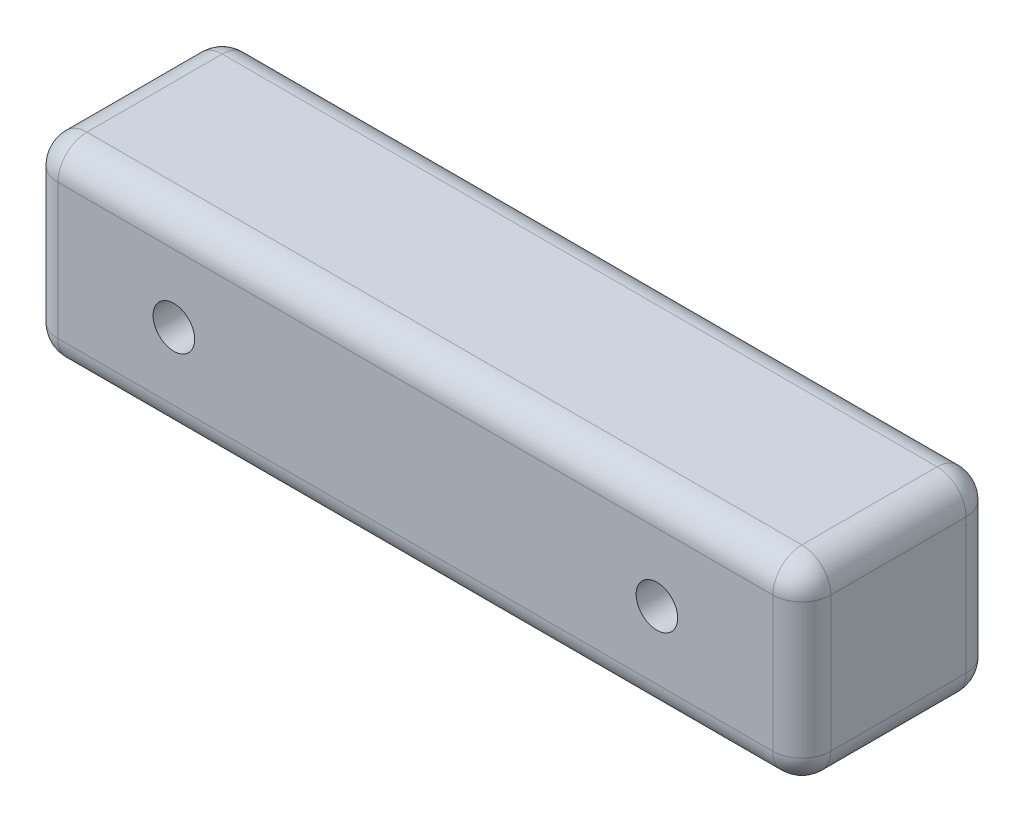
ISO-10303-21;
HEADER;
FILE_DESCRIPTION(('STEP AP214'),'2;1');
FILE_NAME('part.step','',(''),(''),'','','');
FILE_SCHEMA(('AUTOMOTIVE_DESIGN { 1 0 10303 214 1 1 1 1 }'));
ENDSEC;
DATA;
#1=APPLICATION_CONTEXT('core data for automotive mechanical design processes');
#2=APPLICATION_PROTOCOL_DEFINITION('international standard','automotive_design',2000,#1);
#3=PRODUCT_CONTEXT('',#1,'mechanical');
#4=PRODUCT('Part','Part','',(#3));
#5=PRODUCT_RELATED_PRODUCT_CATEGORY('part','',(#4));
#6=PRODUCT_DEFINITION_FORMATION('','',#4);
#7=PRODUCT_DEFINITION_CONTEXT('part definition',#1,'design');
#8=PRODUCT_DEFINITION('design','',#6,#7);
#9=PRODUCT_DEFINITION_SHAPE('','',#8);
#10=(LENGTH_UNIT() NAMED_UNIT(*) SI_UNIT(.MILLI.,.METRE.));
#11=(NAMED_UNIT(*) PLANE_ANGLE_UNIT() SI_UNIT($,.RADIAN.));
#12=(NAMED_UNIT(*) SI_UNIT($,.STERADIAN.) SOLID_ANGLE_UNIT());
#13=UNCERTAINTY_MEASURE_WITH_UNIT(LENGTH_MEASURE(1.E-05),#10,'distance_accuracy_value','');
#14=(GEOMETRIC_REPRESENTATION_CONTEXT(3) GLOBAL_UNCERTAINTY_ASSIGNED_CONTEXT((#13)) GLOBAL_UNIT_ASSIGNED_CONTEXT((#10,
#11,#12)) REPRESENTATION_CONTEXT('',''));
#15=CARTESIAN_POINT('',(0.,0.,0.));
#16=DIRECTION('',(0.,0.,1.));
#17=DIRECTION('',(1.,0.,0.));
#18=AXIS2_PLACEMENT_3D('',#15,#16,#17);
#19=CARTESIAN_POINT('',(0.,0.,20.));
#20=DIRECTION('',(0.,0.,-1.));
#21=DIRECTION('',(-1.,0.,0.));
#22=AXIS2_PLACEMENT_3D('',#19,#20,#21);
#23=PLANE('',#22);
#24=DIRECTION('',(0.,-1.,0.));
#25=VECTOR('',#24,1.);
#26=CARTESIAN_POINT('',(-37.,0.,20.));
#27=LINE('',#26,#25);
#28=CARTESIAN_POINT('',(-37.,6.99999999999999,20.));
#29=VERTEX_POINT('',#28);
#30=CARTESIAN_POINT('',(-37.,-7.00000000000001,20.));
#31=VERTEX_POINT('',#30);
#32=EDGE_CURVE('E166',#29,#31,#27,.T.);
#33=ORIENTED_EDGE('',*,*,#32,.T.);
#34=DIRECTION('',(1.,0.,0.));
#35=VECTOR('',#34,1.);
#36=CARTESIAN_POINT('',(0.,-7.,20.));
#37=LINE('',#36,#35);
#38=CARTESIAN_POINT('',(37.,-6.99999999999999,20.));
#39=VERTEX_POINT('',#38);
#40=EDGE_CURVE('E137',#31,#39,#37,.T.);
#41=ORIENTED_EDGE('',*,*,#40,.T.);
#42=DIRECTION('',(0.,1.,0.));
#43=VECTOR('',#42,1.);
#44=CARTESIAN_POINT('',(37.,0.,20.));
#45=LINE('',#44,#43);
#46=CARTESIAN_POINT('',(37.,7.00000000000001,20.));
#47=VERTEX_POINT('',#46);
#48=EDGE_CURVE('E155',#39,#47,#45,.T.);
#49=ORIENTED_EDGE('',*,*,#48,.T.);
#50=DIRECTION('',(-1.,0.,0.));
#51=VECTOR('',#50,1.);
#52=CARTESIAN_POINT('',(0.,7.,20.));
#53=LINE('',#52,#51);
#54=EDGE_CURVE('E161',#47,#29,#53,.T.);
#55=ORIENTED_EDGE('',*,*,#54,.T.);
#56=EDGE_LOOP('',(#33,#41,#49,#55));
#57=FACE_BOUND('',#56,.T.);
#58=CARTESIAN_POINT('',(25.,0.,20.));
#59=DIRECTION('',(0.,0.,1.));
#60=DIRECTION('',(1.,0.,0.));
#61=AXIS2_PLACEMENT_3D('',#58,#59,#60);
#62=CIRCLE('',#61,2.15);
#63=CARTESIAN_POINT('',(27.15,0.,20.));
#64=VERTEX_POINT('',#63);
#65=EDGE_CURVE('E162',#64,#64,#62,.T.);
#66=ORIENTED_EDGE('',*,*,#65,.F.);
#67=EDGE_LOOP('',(#66));
#68=FACE_BOUND('',#67,.T.);
#69=CARTESIAN_POINT('',(-25.,0.,20.));
#70=DIRECTION('',(0.,0.,1.));
#71=DIRECTION('',(-1.,0.,0.));
#72=AXIS2_PLACEMENT_3D('',#69,#70,#71);
#73=CIRCLE('',#72,2.15);
#74=CARTESIAN_POINT('',(-27.15,0.,20.));
#75=VERTEX_POINT('',#74);
#76=EDGE_CURVE('E270',#75,#75,#73,.T.);
#77=ORIENTED_EDGE('',*,*,#76,.F.);
#78=EDGE_LOOP('',(#77));
#79=FACE_BOUND('',#78,.T.);
#80=ADVANCED_FACE('F39',(#57,#68,#79),#23,.F.);
#81=CARTESIAN_POINT('',(0.,0.,0.));
#82=DIRECTION('',(0.,0.,-1.));
#83=DIRECTION('',(-1.,0.,0.));
#84=AXIS2_PLACEMENT_3D('',#81,#82,#83);
#85=PLANE('',#84);
#86=DIRECTION('',(0.,1.,0.));
#87=VECTOR('',#86,1.);
#88=CARTESIAN_POINT('',(37.,-9.99999999999999,0.));
#89=LINE('',#88,#87);
#90=CARTESIAN_POINT('',(37.,7.00000000000001,0.));
#91=VERTEX_POINT('',#90);
#92=CARTESIAN_POINT('',(37.,-6.99999999999999,0.));
#93=VERTEX_POINT('',#92);
#94=EDGE_CURVE('E63',#91,#93,#89,.F.);
#95=ORIENTED_EDGE('',*,*,#94,.T.);
#96=DIRECTION('',(1.,0.,0.));
#97=VECTOR('',#96,1.);
#98=CARTESIAN_POINT('',(-40.,-7.00000000000001,0.));
#99=LINE('',#98,#97);
#100=CARTESIAN_POINT('',(-37.,-7.00000000000001,0.));
#101=VERTEX_POINT('',#100);
#102=EDGE_CURVE('E11',#93,#101,#99,.F.);
#103=ORIENTED_EDGE('',*,*,#102,.T.);
#104=DIRECTION('',(0.,-1.,0.));
#105=VECTOR('',#104,1.);
#106=CARTESIAN_POINT('',(-37.,9.99999999999999,0.));
#107=LINE('',#106,#105);
#108=CARTESIAN_POINT('',(-37.,6.99999999999999,0.));
#109=VERTEX_POINT('',#108);
#110=EDGE_CURVE('E48',#101,#109,#107,.F.);
#111=ORIENTED_EDGE('',*,*,#110,.T.);
#112=DIRECTION('',(-1.,0.,0.));
#113=VECTOR('',#112,1.);
#114=CARTESIAN_POINT('',(40.,7.00000000000001,0.));
#115=LINE('',#114,#113);
#116=EDGE_CURVE('E206',#109,#91,#115,.F.);
#117=ORIENTED_EDGE('',*,*,#116,.T.);
#118=EDGE_LOOP('',(#95,#103,#111,#117));
#119=FACE_BOUND('',#118,.T.);
#120=CARTESIAN_POINT('',(25.,0.,0.));
#121=DIRECTION('',(0.,0.,1.));
#122=DIRECTION('',(1.,0.,0.));
#123=AXIS2_PLACEMENT_3D('',#120,#121,#122);
#124=CIRCLE('',#123,2.15);
#125=CARTESIAN_POINT('',(27.15,0.,0.));
#126=VERTEX_POINT('',#125);
#127=EDGE_CURVE('E275',#126,#126,#124,.T.);
#128=ORIENTED_EDGE('',*,*,#127,.T.);
#129=EDGE_LOOP('',(#128));
#130=FACE_BOUND('',#129,.T.);
#131=CARTESIAN_POINT('',(-25.,0.,0.));
#132=DIRECTION('',(0.,0.,1.));
#133=DIRECTION('',(-1.,0.,0.));
#134=AXIS2_PLACEMENT_3D('',#131,#132,#133);
#135=CIRCLE('',#134,2.15);
#136=CARTESIAN_POINT('',(-27.15,0.,0.));
#137=VERTEX_POINT('',#136);
#138=EDGE_CURVE('E264',#137,#137,#135,.T.);
#139=ORIENTED_EDGE('',*,*,#138,.T.);
#140=EDGE_LOOP('',(#139));
#141=FACE_BOUND('',#140,.T.);
#142=ADVANCED_FACE('F331',(#119,#130,#141),#85,.T.);
#143=CARTESIAN_POINT('',(-40.,-10.,20.));
#144=DIRECTION('',(1.,0.,0.));
#145=DIRECTION('',(0.,1.,0.));
#146=AXIS2_PLACEMENT_3D('',#143,#144,#145);
#147=PLANE('',#146);
#148=DIRECTION('',(0.,-1.,0.));
#149=VECTOR('',#148,1.);
#150=CARTESIAN_POINT('',(-40.,-10.,3.));
#151=LINE('',#150,#149);
#152=CARTESIAN_POINT('',(-40.,6.99999999999999,3.));
#153=VERTEX_POINT('',#152);
#154=CARTESIAN_POINT('',(-40.,-7.00000000000001,3.));
#155=VERTEX_POINT('',#154);
#156=EDGE_CURVE('E181',#153,#155,#151,.T.);
#157=ORIENTED_EDGE('',*,*,#156,.T.);
#158=DIRECTION('',(0.,0.,-1.));
#159=VECTOR('',#158,1.);
#160=CARTESIAN_POINT('',(-40.,-7.00000000000001,20.));
#161=LINE('',#160,#159);
#162=CARTESIAN_POINT('',(-40.,-7.00000000000001,17.));
#163=VERTEX_POINT('',#162);
#164=EDGE_CURVE('E185',#155,#163,#161,.F.);
#165=ORIENTED_EDGE('',*,*,#164,.T.);
#166=DIRECTION('',(0.,-1.,0.));
#167=VECTOR('',#166,1.);
#168=CARTESIAN_POINT('',(-40.,-10.,17.));
#169=LINE('',#168,#167);
#170=CARTESIAN_POINT('',(-40.,6.99999999999999,17.));
#171=VERTEX_POINT('',#170);
#172=EDGE_CURVE('E183',#163,#171,#169,.F.);
#173=ORIENTED_EDGE('',*,*,#172,.T.);
#174=DIRECTION('',(0.,0.,-1.));
#175=VECTOR('',#174,1.);
#176=CARTESIAN_POINT('',(-40.,6.99999999999999,20.));
#177=LINE('',#176,#175);
#178=EDGE_CURVE('E179',#171,#153,#177,.T.);
#179=ORIENTED_EDGE('',*,*,#178,.T.);
#180=EDGE_LOOP('',(#157,#165,#173,#179));
#181=FACE_BOUND('',#180,.T.);
#182=ADVANCED_FACE('F337',(#181),#147,.F.);
#183=CARTESIAN_POINT('',(40.,-9.99999999999999,20.));
#184=DIRECTION('',(0.,1.,0.));
#185=DIRECTION('',(-1.,0.,0.));
#186=AXIS2_PLACEMENT_3D('',#183,#184,#185);
#187=PLANE('',#186);
#188=DIRECTION('',(0.,0.,-1.));
#189=VECTOR('',#188,1.);
#190=CARTESIAN_POINT('',(37.,-9.99999999999999,20.));
#191=LINE('',#190,#189);
#192=CARTESIAN_POINT('',(37.,-9.99999999999999,3.));
#193=VERTEX_POINT('',#192);
#194=CARTESIAN_POINT('',(37.,-9.99999999999999,17.));
#195=VERTEX_POINT('',#194);
#196=EDGE_CURVE('E170',#193,#195,#191,.F.);
#197=ORIENTED_EDGE('',*,*,#196,.T.);
#198=DIRECTION('',(1.,0.,0.));
#199=VECTOR('',#198,1.);
#200=CARTESIAN_POINT('',(40.,-9.99999999999999,17.));
#201=LINE('',#200,#199);
#202=CARTESIAN_POINT('',(-37.,-10.,17.));
#203=VERTEX_POINT('',#202);
#204=EDGE_CURVE('E139',#195,#203,#201,.F.);
#205=ORIENTED_EDGE('',*,*,#204,.T.);
#206=DIRECTION('',(0.,0.,-1.));
#207=VECTOR('',#206,1.);
#208=CARTESIAN_POINT('',(-37.,-10.,20.));
#209=LINE('',#208,#207);
#210=CARTESIAN_POINT('',(-37.,-10.,3.));
#211=VERTEX_POINT('',#210);
#212=EDGE_CURVE('E176',#203,#211,#209,.T.);
#213=ORIENTED_EDGE('',*,*,#212,.T.);
#214=DIRECTION('',(1.,0.,0.));
#215=VECTOR('',#214,1.);
#216=CARTESIAN_POINT('',(40.,-9.99999999999999,3.));
#217=LINE('',#216,#215);
#218=EDGE_CURVE('E168',#211,#193,#217,.T.);
#219=ORIENTED_EDGE('',*,*,#218,.T.);
#220=EDGE_LOOP('',(#197,#205,#213,#219));
#221=FACE_BOUND('',#220,.T.);
#222=ADVANCED_FACE('F303',(#221),#187,.F.);
#223=CARTESIAN_POINT('',(40.,10.,20.));
#224=DIRECTION('',(-1.,0.,0.));
#225=DIRECTION('',(0.,-1.,0.));
#226=AXIS2_PLACEMENT_3D('',#223,#224,#225);
#227=PLANE('',#226);
#228=DIRECTION('',(0.,0.,-1.));
#229=VECTOR('',#228,1.);
#230=CARTESIAN_POINT('',(40.,7.00000000000001,20.));
#231=LINE('',#230,#229);
#232=CARTESIAN_POINT('',(40.,7.00000000000001,3.));
#233=VERTEX_POINT('',#232);
#234=CARTESIAN_POINT('',(40.,7.00000000000001,17.));
#235=VERTEX_POINT('',#234);
#236=EDGE_CURVE('E199',#233,#235,#231,.F.);
#237=ORIENTED_EDGE('',*,*,#236,.T.);
#238=DIRECTION('',(0.,1.,0.));
#239=VECTOR('',#238,1.);
#240=CARTESIAN_POINT('',(40.,10.,17.));
#241=LINE('',#240,#239);
#242=CARTESIAN_POINT('',(40.,-6.99999999999999,17.));
#243=VERTEX_POINT('',#242);
#244=EDGE_CURVE('E203',#235,#243,#241,.F.);
#245=ORIENTED_EDGE('',*,*,#244,.T.);
#246=DIRECTION('',(0.,0.,-1.));
#247=VECTOR('',#246,1.);
#248=CARTESIAN_POINT('',(40.,-6.99999999999999,20.));
#249=LINE('',#248,#247);
#250=CARTESIAN_POINT('',(40.,-6.99999999999999,3.));
#251=VERTEX_POINT('',#250);
#252=EDGE_CURVE('E201',#243,#251,#249,.T.);
#253=ORIENTED_EDGE('',*,*,#252,.T.);
#254=DIRECTION('',(0.,1.,0.));
#255=VECTOR('',#254,1.);
#256=CARTESIAN_POINT('',(40.,10.,3.));
#257=LINE('',#256,#255);
#258=EDGE_CURVE('E197',#251,#233,#257,.T.);
#259=ORIENTED_EDGE('',*,*,#258,.T.);
#260=EDGE_LOOP('',(#237,#245,#253,#259));
#261=FACE_BOUND('',#260,.T.);
#262=ADVANCED_FACE('F311',(#261),#227,.F.);
#263=CARTESIAN_POINT('',(-40.,9.99999999999999,20.));
#264=DIRECTION('',(0.,-1.,0.));
#265=DIRECTION('',(1.,0.,0.));
#266=AXIS2_PLACEMENT_3D('',#263,#264,#265);
#267=PLANE('',#266);
#268=DIRECTION('',(0.,0.,-1.));
#269=VECTOR('',#268,1.);
#270=CARTESIAN_POINT('',(-37.,9.99999999999999,20.));
#271=LINE('',#270,#269);
#272=CARTESIAN_POINT('',(-37.,9.99999999999999,3.));
#273=VERTEX_POINT('',#272);
#274=CARTESIAN_POINT('',(-37.,9.99999999999999,17.));
#275=VERTEX_POINT('',#274);
#276=EDGE_CURVE('E192',#273,#275,#271,.F.);
#277=ORIENTED_EDGE('',*,*,#276,.T.);
#278=DIRECTION('',(-1.,0.,0.));
#279=VECTOR('',#278,1.);
#280=CARTESIAN_POINT('',(-40.,9.99999999999999,17.));
#281=LINE('',#280,#279);
#282=CARTESIAN_POINT('',(37.,10.,17.));
#283=VERTEX_POINT('',#282);
#284=EDGE_CURVE('E194',#275,#283,#281,.F.);
#285=ORIENTED_EDGE('',*,*,#284,.T.);
#286=DIRECTION('',(0.,0.,-1.));
#287=VECTOR('',#286,1.);
#288=CARTESIAN_POINT('',(37.,10.,20.));
#289=LINE('',#288,#287);
#290=CARTESIAN_POINT('',(37.,10.,3.));
#291=VERTEX_POINT('',#290);
#292=EDGE_CURVE('E190',#283,#291,#289,.T.);
#293=ORIENTED_EDGE('',*,*,#292,.T.);
#294=DIRECTION('',(-1.,0.,0.));
#295=VECTOR('',#294,1.);
#296=CARTESIAN_POINT('',(-40.,9.99999999999999,3.));
#297=LINE('',#296,#295);
#298=EDGE_CURVE('E188',#291,#273,#297,.T.);
#299=ORIENTED_EDGE('',*,*,#298,.T.);
#300=EDGE_LOOP('',(#277,#285,#293,#299));
#301=FACE_BOUND('',#300,.T.);
#302=ADVANCED_FACE('F343',(#301),#267,.F.);
#303=CARTESIAN_POINT('',(25.,0.,20.));
#304=DIRECTION('',(0.,0.,-1.));
#305=DIRECTION('',(-1.,0.,0.));
#306=AXIS2_PLACEMENT_3D('',#303,#304,#305);
#307=CYLINDRICAL_SURFACE('',#306,2.15);
#308=ORIENTED_EDGE('',*,*,#65,.T.);
#309=EDGE_LOOP('',(#308));
#310=FACE_BOUND('',#309,.T.);
#311=ORIENTED_EDGE('',*,*,#127,.F.);
#312=EDGE_LOOP('',(#311));
#313=FACE_BOUND('',#312,.T.);
#314=ADVANCED_FACE('F340',(#310,#313),#307,.F.);
#315=CARTESIAN_POINT('',(-25.,0.,20.));
#316=DIRECTION('',(0.,0.,-1.));
#317=DIRECTION('',(-1.,0.,0.));
#318=AXIS2_PLACEMENT_3D('',#315,#316,#317);
#319=CYLINDRICAL_SURFACE('',#318,2.15);
#320=ORIENTED_EDGE('',*,*,#76,.T.);
#321=EDGE_LOOP('',(#320));
#322=FACE_BOUND('',#321,.T.);
#323=ORIENTED_EDGE('',*,*,#138,.F.);
#324=EDGE_LOOP('',(#323));
#325=FACE_BOUND('',#324,.T.);
#326=ADVANCED_FACE('F501',(#322,#325),#319,.F.);
#327=CARTESIAN_POINT('',(-40.,6.99999999999999,3.));
#328=DIRECTION('',(1.,0.,0.));
#329=DIRECTION('',(0.,1.,0.));
#330=AXIS2_PLACEMENT_3D('',#327,#328,#329);
#331=CYLINDRICAL_SURFACE('',#330,3.);
#332=CARTESIAN_POINT('',(-37.,6.99999999999999,3.));
#333=DIRECTION('',(-1.,0.,0.));
#334=DIRECTION('',(0.,0.,1.));
#335=AXIS2_PLACEMENT_3D('',#332,#333,#334);
#336=CIRCLE('',#335,3.);
#337=EDGE_CURVE('E43',#273,#109,#336,.T.);
#338=ORIENTED_EDGE('',*,*,#337,.F.);
#339=ORIENTED_EDGE('',*,*,#298,.F.);
#340=CARTESIAN_POINT('',(37.,7.00000000000001,3.));
#341=DIRECTION('',(1.,0.,0.));
#342=DIRECTION('',(0.,0.,-1.));
#343=AXIS2_PLACEMENT_3D('',#340,#341,#342);
#344=CIRCLE('',#343,3.);
#345=EDGE_CURVE('E257',#91,#291,#344,.T.);
#346=ORIENTED_EDGE('',*,*,#345,.F.);
#347=ORIENTED_EDGE('',*,*,#116,.F.);
#348=EDGE_LOOP('',(#338,#339,#346,#347));
#349=FACE_BOUND('',#348,.T.);
#350=ADVANCED_FACE('F41',(#349),#331,.T.);
#351=CARTESIAN_POINT('',(-37.,6.99999999999999,3.));
#352=DIRECTION('',(0.,0.,-1.));
#353=DIRECTION('',(-1.,0.,0.));
#354=AXIS2_PLACEMENT_3D('',#351,#352,#353);
#355=SPHERICAL_SURFACE('',#354,3.);
#356=CARTESIAN_POINT('',(-37.,6.99999999999999,3.));
#357=DIRECTION('',(0.,0.,-1.));
#358=DIRECTION('',(-1.,0.,0.));
#359=AXIS2_PLACEMENT_3D('',#356,#357,#358);
#360=CIRCLE('',#359,3.);
#361=EDGE_CURVE('E252',#273,#153,#360,.F.);
#362=ORIENTED_EDGE('',*,*,#361,.F.);
#363=ORIENTED_EDGE('',*,*,#337,.T.);
#364=CARTESIAN_POINT('',(-37.,6.99999999999999,3.));
#365=DIRECTION('',(0.,1.,0.));
#366=DIRECTION('',(-1.,0.,0.));
#367=AXIS2_PLACEMENT_3D('',#364,#365,#366);
#368=CIRCLE('',#367,3.);
#369=EDGE_CURVE('E255',#153,#109,#368,.F.);
#370=ORIENTED_EDGE('',*,*,#369,.F.);
#371=EDGE_LOOP('',(#362,#363,#370));
#372=FACE_BOUND('',#371,.T.);
#373=ADVANCED_FACE('F487',(#372),#355,.T.);
#374=CARTESIAN_POINT('',(37.,7.00000000000001,3.));
#375=DIRECTION('',(0.,1.,0.));
#376=DIRECTION('',(0.,0.,1.));
#377=AXIS2_PLACEMENT_3D('',#374,#375,#376);
#378=SPHERICAL_SURFACE('',#377,3.);
#379=CARTESIAN_POINT('',(37.,7.00000000000001,3.));
#380=DIRECTION('',(0.,1.,0.));
#381=DIRECTION('',(-1.,0.,0.));
#382=AXIS2_PLACEMENT_3D('',#379,#380,#381);
#383=CIRCLE('',#382,3.);
#384=EDGE_CURVE('E246',#91,#233,#383,.F.);
#385=ORIENTED_EDGE('',*,*,#384,.F.);
#386=ORIENTED_EDGE('',*,*,#345,.T.);
#387=CARTESIAN_POINT('',(37.,7.00000000000001,3.));
#388=DIRECTION('',(0.,0.,-1.));
#389=DIRECTION('',(-1.,0.,0.));
#390=AXIS2_PLACEMENT_3D('',#387,#388,#389);
#391=CIRCLE('',#390,3.);
#392=EDGE_CURVE('E249',#233,#291,#391,.F.);
#393=ORIENTED_EDGE('',*,*,#392,.F.);
#394=EDGE_LOOP('',(#385,#386,#393));
#395=FACE_BOUND('',#394,.T.);
#396=ADVANCED_FACE('F478',(#395),#378,.T.);
#397=CARTESIAN_POINT('',(-37.,-10.,3.));
#398=DIRECTION('',(0.,1.,0.));
#399=DIRECTION('',(-1.,0.,0.));
#400=AXIS2_PLACEMENT_3D('',#397,#398,#399);
#401=CYLINDRICAL_SURFACE('',#400,3.);
#402=ORIENTED_EDGE('',*,*,#369,.T.);
#403=ORIENTED_EDGE('',*,*,#110,.F.);
#404=CARTESIAN_POINT('',(-37.,-7.00000000000001,3.));
#405=DIRECTION('',(0.,-1.,0.));
#406=DIRECTION('',(1.,0.,0.));
#407=AXIS2_PLACEMENT_3D('',#404,#405,#406);
#408=CIRCLE('',#407,3.);
#409=EDGE_CURVE('E56',#155,#101,#408,.T.);
#410=ORIENTED_EDGE('',*,*,#409,.F.);
#411=ORIENTED_EDGE('',*,*,#156,.F.);
#412=EDGE_LOOP('',(#402,#403,#410,#411));
#413=FACE_BOUND('',#412,.T.);
#414=ADVANCED_FACE('F469',(#413),#401,.T.);
#415=CARTESIAN_POINT('',(-37.,6.99999999999999,20.));
#416=DIRECTION('',(0.,0.,-1.));
#417=DIRECTION('',(-1.,0.,0.));
#418=AXIS2_PLACEMENT_3D('',#415,#416,#417);
#419=CYLINDRICAL_SURFACE('',#418,3.);
#420=ORIENTED_EDGE('',*,*,#361,.T.);
#421=ORIENTED_EDGE('',*,*,#178,.F.);
#422=CARTESIAN_POINT('',(-37.,6.99999999999999,17.));
#423=DIRECTION('',(0.,0.,1.));
#424=DIRECTION('',(1.,0.,0.));
#425=AXIS2_PLACEMENT_3D('',#422,#423,#424);
#426=CIRCLE('',#425,3.);
#427=EDGE_CURVE('E240',#275,#171,#426,.T.);
#428=ORIENTED_EDGE('',*,*,#427,.F.);
#429=ORIENTED_EDGE('',*,*,#276,.F.);
#430=EDGE_LOOP('',(#420,#421,#428,#429));
#431=FACE_BOUND('',#430,.T.);
#432=ADVANCED_FACE('F461',(#431),#419,.T.);
#433=CARTESIAN_POINT('',(0.,7.,17.));
#434=DIRECTION('',(-1.,0.,0.));
#435=DIRECTION('',(0.,-1.,0.));
#436=AXIS2_PLACEMENT_3D('',#433,#434,#435);
#437=CYLINDRICAL_SURFACE('',#436,3.);
#438=CARTESIAN_POINT('',(37.,7.00000000000001,17.));
#439=DIRECTION('',(1.,0.,0.));
#440=DIRECTION('',(0.,0.,-1.));
#441=AXIS2_PLACEMENT_3D('',#438,#439,#440);
#442=CIRCLE('',#441,3.);
#443=EDGE_CURVE('E234',#283,#47,#442,.T.);
#444=ORIENTED_EDGE('',*,*,#443,.F.);
#445=ORIENTED_EDGE('',*,*,#284,.F.);
#446=CARTESIAN_POINT('',(-37.,6.99999999999999,17.));
#447=DIRECTION('',(-1.,0.,0.));
#448=DIRECTION('',(0.,-1.,0.));
#449=AXIS2_PLACEMENT_3D('',#446,#447,#448);
#450=CIRCLE('',#449,3.);
#451=EDGE_CURVE('E237',#29,#275,#450,.T.);
#452=ORIENTED_EDGE('',*,*,#451,.F.);
#453=ORIENTED_EDGE('',*,*,#54,.F.);
#454=EDGE_LOOP('',(#444,#445,#452,#453));
#455=FACE_BOUND('',#454,.T.);
#456=ADVANCED_FACE('F286',(#455),#437,.T.);
#457=CARTESIAN_POINT('',(37.,7.00000000000001,20.));
#458=DIRECTION('',(0.,0.,-1.));
#459=DIRECTION('',(-1.,0.,0.));
#460=AXIS2_PLACEMENT_3D('',#457,#458,#459);
#461=CYLINDRICAL_SURFACE('',#460,3.);
#462=ORIENTED_EDGE('',*,*,#392,.T.);
#463=ORIENTED_EDGE('',*,*,#292,.F.);
#464=CARTESIAN_POINT('',(37.,7.00000000000001,17.));
#465=DIRECTION('',(0.,0.,1.));
#466=DIRECTION('',(1.,0.,0.));
#467=AXIS2_PLACEMENT_3D('',#464,#465,#466);
#468=CIRCLE('',#467,3.);
#469=EDGE_CURVE('E232',#235,#283,#468,.T.);
#470=ORIENTED_EDGE('',*,*,#469,.F.);
#471=ORIENTED_EDGE('',*,*,#236,.F.);
#472=EDGE_LOOP('',(#462,#463,#470,#471));
#473=FACE_BOUND('',#472,.T.);
#474=ADVANCED_FACE('F316',(#473),#461,.T.);
#475=CARTESIAN_POINT('',(37.,10.,3.));
#476=DIRECTION('',(0.,-1.,0.));
#477=DIRECTION('',(1.,0.,0.));
#478=AXIS2_PLACEMENT_3D('',#475,#476,#477);
#479=CYLINDRICAL_SURFACE('',#478,3.);
#480=ORIENTED_EDGE('',*,*,#384,.T.);
#481=ORIENTED_EDGE('',*,*,#258,.F.);
#482=CARTESIAN_POINT('',(37.,-6.99999999999999,3.));
#483=DIRECTION('',(0.,-1.,0.));
#484=DIRECTION('',(1.,0.,0.));
#485=AXIS2_PLACEMENT_3D('',#482,#483,#484);
#486=CIRCLE('',#485,3.);
#487=EDGE_CURVE('E229',#93,#251,#486,.T.);
#488=ORIENTED_EDGE('',*,*,#487,.F.);
#489=ORIENTED_EDGE('',*,*,#94,.F.);
#490=EDGE_LOOP('',(#480,#481,#488,#489));
#491=FACE_BOUND('',#490,.T.);
#492=ADVANCED_FACE('F437',(#491),#479,.T.);
#493=CARTESIAN_POINT('',(40.,-6.99999999999999,3.));
#494=DIRECTION('',(-1.,0.,0.));
#495=DIRECTION('',(0.,-1.,0.));
#496=AXIS2_PLACEMENT_3D('',#493,#494,#495);
#497=CYLINDRICAL_SURFACE('',#496,3.);
#498=CARTESIAN_POINT('',(-37.,-7.00000000000001,3.));
#499=DIRECTION('',(-1.,0.,0.));
#500=DIRECTION('',(0.,0.,1.));
#501=AXIS2_PLACEMENT_3D('',#498,#499,#500);
#502=CIRCLE('',#501,3.);
#503=EDGE_CURVE('E244',#101,#211,#502,.T.);
#504=ORIENTED_EDGE('',*,*,#503,.F.);
#505=ORIENTED_EDGE('',*,*,#102,.F.);
#506=CARTESIAN_POINT('',(37.,-6.99999999999999,3.));
#507=DIRECTION('',(1.,0.,0.));
#508=DIRECTION('',(0.,0.,-1.));
#509=AXIS2_PLACEMENT_3D('',#506,#507,#508);
#510=CIRCLE('',#509,3.);
#511=EDGE_CURVE('E226',#193,#93,#510,.T.);
#512=ORIENTED_EDGE('',*,*,#511,.F.);
#513=ORIENTED_EDGE('',*,*,#218,.F.);
#514=EDGE_LOOP('',(#504,#505,#512,#513));
#515=FACE_BOUND('',#514,.T.);
#516=ADVANCED_FACE('F429',(#515),#497,.T.);
#517=CARTESIAN_POINT('',(-37.,-7.00000000000001,3.));
#518=DIRECTION('',(0.,0.,-1.));
#519=DIRECTION('',(-1.,0.,0.));
#520=AXIS2_PLACEMENT_3D('',#517,#518,#519);
#521=SPHERICAL_SURFACE('',#520,3.);
#522=ORIENTED_EDGE('',*,*,#409,.T.);
#523=ORIENTED_EDGE('',*,*,#503,.T.);
#524=CARTESIAN_POINT('',(-37.,-7.00000000000001,3.));
#525=DIRECTION('',(0.,0.,-1.));
#526=DIRECTION('',(-1.,0.,0.));
#527=AXIS2_PLACEMENT_3D('',#524,#525,#526);
#528=CIRCLE('',#527,3.);
#529=EDGE_CURVE('E223',#155,#211,#528,.F.);
#530=ORIENTED_EDGE('',*,*,#529,.F.);
#531=EDGE_LOOP('',(#522,#523,#530));
#532=FACE_BOUND('',#531,.T.);
#533=ADVANCED_FACE('F328',(#532),#521,.T.);
#534=CARTESIAN_POINT('',(-37.,6.99999999999999,17.));
#535=DIRECTION('',(0.,1.,0.));
#536=DIRECTION('',(0.,0.,1.));
#537=AXIS2_PLACEMENT_3D('',#534,#535,#536);
#538=SPHERICAL_SURFACE('',#537,3.);
#539=ORIENTED_EDGE('',*,*,#451,.T.);
#540=ORIENTED_EDGE('',*,*,#427,.T.);
#541=CARTESIAN_POINT('',(-37.,6.99999999999999,17.));
#542=DIRECTION('',(0.,1.,0.));
#543=DIRECTION('',(0.,0.,1.));
#544=AXIS2_PLACEMENT_3D('',#541,#542,#543);
#545=CIRCLE('',#544,3.);
#546=EDGE_CURVE('E220',#29,#171,#545,.F.);
#547=ORIENTED_EDGE('',*,*,#546,.F.);
#548=EDGE_LOOP('',(#539,#540,#547));
#549=FACE_BOUND('',#548,.T.);
#550=ADVANCED_FACE('F289',(#549),#538,.T.);
#551=CARTESIAN_POINT('',(37.,7.00000000000001,17.));
#552=DIRECTION('',(0.,1.,0.));
#553=DIRECTION('',(0.,0.,1.));
#554=AXIS2_PLACEMENT_3D('',#551,#552,#553);
#555=SPHERICAL_SURFACE('',#554,3.);
#556=ORIENTED_EDGE('',*,*,#469,.T.);
#557=ORIENTED_EDGE('',*,*,#443,.T.);
#558=CARTESIAN_POINT('',(37.,7.00000000000001,17.));
#559=DIRECTION('',(0.,1.,0.));
#560=DIRECTION('',(-1.,0.,0.));
#561=AXIS2_PLACEMENT_3D('',#558,#559,#560);
#562=CIRCLE('',#561,3.);
#563=EDGE_CURVE('E158',#235,#47,#562,.F.);
#564=ORIENTED_EDGE('',*,*,#563,.F.);
#565=EDGE_LOOP('',(#556,#557,#564));
#566=FACE_BOUND('',#565,.T.);
#567=ADVANCED_FACE('F318',(#566),#555,.T.);
#568=CARTESIAN_POINT('',(37.,-6.99999999999999,3.));
#569=DIRECTION('',(0.,0.,-1.));
#570=DIRECTION('',(-1.,0.,0.));
#571=AXIS2_PLACEMENT_3D('',#568,#569,#570);
#572=SPHERICAL_SURFACE('',#571,3.);
#573=ORIENTED_EDGE('',*,*,#511,.T.);
#574=ORIENTED_EDGE('',*,*,#487,.T.);
#575=CARTESIAN_POINT('',(37.,-6.99999999999999,3.));
#576=DIRECTION('',(0.,0.,-1.));
#577=DIRECTION('',(-1.,0.,0.));
#578=AXIS2_PLACEMENT_3D('',#575,#576,#577);
#579=CIRCLE('',#578,3.);
#580=EDGE_CURVE('E216',#193,#251,#579,.F.);
#581=ORIENTED_EDGE('',*,*,#580,.F.);
#582=EDGE_LOOP('',(#573,#574,#581));
#583=FACE_BOUND('',#582,.T.);
#584=ADVANCED_FACE('F320',(#583),#572,.T.);
#585=CARTESIAN_POINT('',(-37.,-7.00000000000001,20.));
#586=DIRECTION('',(0.,0.,-1.));
#587=DIRECTION('',(-1.,0.,0.));
#588=AXIS2_PLACEMENT_3D('',#585,#586,#587);
#589=CYLINDRICAL_SURFACE('',#588,3.);
#590=ORIENTED_EDGE('',*,*,#529,.T.);
#591=ORIENTED_EDGE('',*,*,#212,.F.);
#592=CARTESIAN_POINT('',(-37.,-7.00000000000001,17.));
#593=DIRECTION('',(0.,0.,1.));
#594=DIRECTION('',(1.,0.,0.));
#595=AXIS2_PLACEMENT_3D('',#592,#593,#594);
#596=CIRCLE('',#595,3.);
#597=EDGE_CURVE('E213',#163,#203,#596,.T.);
#598=ORIENTED_EDGE('',*,*,#597,.F.);
#599=ORIENTED_EDGE('',*,*,#164,.F.);
#600=EDGE_LOOP('',(#590,#591,#598,#599));
#601=FACE_BOUND('',#600,.T.);
#602=ADVANCED_FACE('F300',(#601),#589,.T.);
#603=CARTESIAN_POINT('',(-37.,0.,17.));
#604=DIRECTION('',(0.,-1.,0.));
#605=DIRECTION('',(1.,0.,0.));
#606=AXIS2_PLACEMENT_3D('',#603,#604,#605);
#607=CYLINDRICAL_SURFACE('',#606,3.);
#608=ORIENTED_EDGE('',*,*,#546,.T.);
#609=ORIENTED_EDGE('',*,*,#172,.F.);
#610=CARTESIAN_POINT('',(-37.,-7.00000000000001,17.));
#611=DIRECTION('',(0.,-1.,0.));
#612=DIRECTION('',(1.,0.,0.));
#613=AXIS2_PLACEMENT_3D('',#610,#611,#612);
#614=CIRCLE('',#613,3.);
#615=EDGE_CURVE('E152',#31,#163,#614,.T.);
#616=ORIENTED_EDGE('',*,*,#615,.F.);
#617=ORIENTED_EDGE('',*,*,#32,.F.);
#618=EDGE_LOOP('',(#608,#609,#616,#617));
#619=FACE_BOUND('',#618,.T.);
#620=ADVANCED_FACE('F292',(#619),#607,.T.);
#621=CARTESIAN_POINT('',(37.,0.,17.));
#622=DIRECTION('',(0.,1.,0.));
#623=DIRECTION('',(-1.,0.,0.));
#624=AXIS2_PLACEMENT_3D('',#621,#622,#623);
#625=CYLINDRICAL_SURFACE('',#624,3.);
#626=ORIENTED_EDGE('',*,*,#563,.T.);
#627=ORIENTED_EDGE('',*,*,#48,.F.);
#628=CARTESIAN_POINT('',(37.,-6.99999999999999,17.));
#629=DIRECTION('',(0.,-1.,0.));
#630=DIRECTION('',(0.,0.,-1.));
#631=AXIS2_PLACEMENT_3D('',#628,#629,#630);
#632=CIRCLE('',#631,3.);
#633=EDGE_CURVE('E144',#243,#39,#632,.T.);
#634=ORIENTED_EDGE('',*,*,#633,.F.);
#635=ORIENTED_EDGE('',*,*,#244,.F.);
#636=EDGE_LOOP('',(#626,#627,#634,#635));
#637=FACE_BOUND('',#636,.T.);
#638=ADVANCED_FACE('F156',(#637),#625,.T.);
#639=CARTESIAN_POINT('',(37.,-6.99999999999999,20.));
#640=DIRECTION('',(0.,0.,-1.));
#641=DIRECTION('',(-1.,0.,0.));
#642=AXIS2_PLACEMENT_3D('',#639,#640,#641);
#643=CYLINDRICAL_SURFACE('',#642,3.);
#644=ORIENTED_EDGE('',*,*,#580,.T.);
#645=ORIENTED_EDGE('',*,*,#252,.F.);
#646=CARTESIAN_POINT('',(37.,-6.99999999999999,17.));
#647=DIRECTION('',(0.,0.,1.));
#648=DIRECTION('',(1.,0.,0.));
#649=AXIS2_PLACEMENT_3D('',#646,#647,#648);
#650=CIRCLE('',#649,3.);
#651=EDGE_CURVE('E148',#195,#243,#650,.T.);
#652=ORIENTED_EDGE('',*,*,#651,.F.);
#653=ORIENTED_EDGE('',*,*,#196,.F.);
#654=EDGE_LOOP('',(#644,#645,#652,#653));
#655=FACE_BOUND('',#654,.T.);
#656=ADVANCED_FACE('F307',(#655),#643,.T.);
#657=CARTESIAN_POINT('',(-37.,-7.00000000000001,17.));
#658=DIRECTION('',(-1.,0.,0.));
#659=DIRECTION('',(0.,-1.,0.));
#660=AXIS2_PLACEMENT_3D('',#657,#658,#659);
#661=SPHERICAL_SURFACE('',#660,3.);
#662=ORIENTED_EDGE('',*,*,#615,.T.);
#663=ORIENTED_EDGE('',*,*,#597,.T.);
#664=CARTESIAN_POINT('',(-37.,-7.00000000000001,17.));
#665=DIRECTION('',(-1.,0.,0.));
#666=DIRECTION('',(0.,0.,1.));
#667=AXIS2_PLACEMENT_3D('',#664,#665,#666);
#668=CIRCLE('',#667,3.);
#669=EDGE_CURVE('E141',#31,#203,#668,.F.);
#670=ORIENTED_EDGE('',*,*,#669,.F.);
#671=EDGE_LOOP('',(#662,#663,#670));
#672=FACE_BOUND('',#671,.T.);
#673=ADVANCED_FACE('F296',(#672),#661,.T.);
#674=CARTESIAN_POINT('',(37.,-6.99999999999999,17.));
#675=DIRECTION('',(1.,0.,0.));
#676=DIRECTION('',(0.,1.,0.));
#677=AXIS2_PLACEMENT_3D('',#674,#675,#676);
#678=SPHERICAL_SURFACE('',#677,3.);
#679=ORIENTED_EDGE('',*,*,#651,.T.);
#680=ORIENTED_EDGE('',*,*,#633,.T.);
#681=CARTESIAN_POINT('',(37.,-6.99999999999999,17.));
#682=DIRECTION('',(1.,0.,0.));
#683=DIRECTION('',(0.,0.,-1.));
#684=AXIS2_PLACEMENT_3D('',#681,#682,#683);
#685=CIRCLE('',#684,3.);
#686=EDGE_CURVE('E133',#195,#39,#685,.F.);
#687=ORIENTED_EDGE('',*,*,#686,.F.);
#688=EDGE_LOOP('',(#679,#680,#687));
#689=FACE_BOUND('',#688,.T.);
#690=ADVANCED_FACE('F146',(#689),#678,.T.);
#691=CARTESIAN_POINT('',(0.,-7.,17.));
#692=DIRECTION('',(1.,0.,0.));
#693=DIRECTION('',(0.,1.,0.));
#694=AXIS2_PLACEMENT_3D('',#691,#692,#693);
#695=CYLINDRICAL_SURFACE('',#694,3.);
#696=ORIENTED_EDGE('',*,*,#669,.T.);
#697=ORIENTED_EDGE('',*,*,#204,.F.);
#698=ORIENTED_EDGE('',*,*,#686,.T.);
#699=ORIENTED_EDGE('',*,*,#40,.F.);
#700=EDGE_LOOP('',(#696,#697,#698,#699));
#701=FACE_BOUND('',#700,.T.);
#702=ADVANCED_FACE('F135',(#701),#695,.T.);
#703=CLOSED_SHELL('',(#80,#142,#182,#222,#262,#302,#314,#326,#350,#373,#396,#414,#432,#456,#474,
#492,#516,#533,#550,#567,#584,#602,#620,#638,#656,#673,#690,#702));
#704=MANIFOLD_SOLID_BREP('B2',#703);
#705=ADVANCED_BREP_SHAPE_REPRESENTATION('',(#18,#704),#14);
#706=SHAPE_DEFINITION_REPRESENTATION(#9,#705);
ENDSEC;
END-ISO-10303-21;
